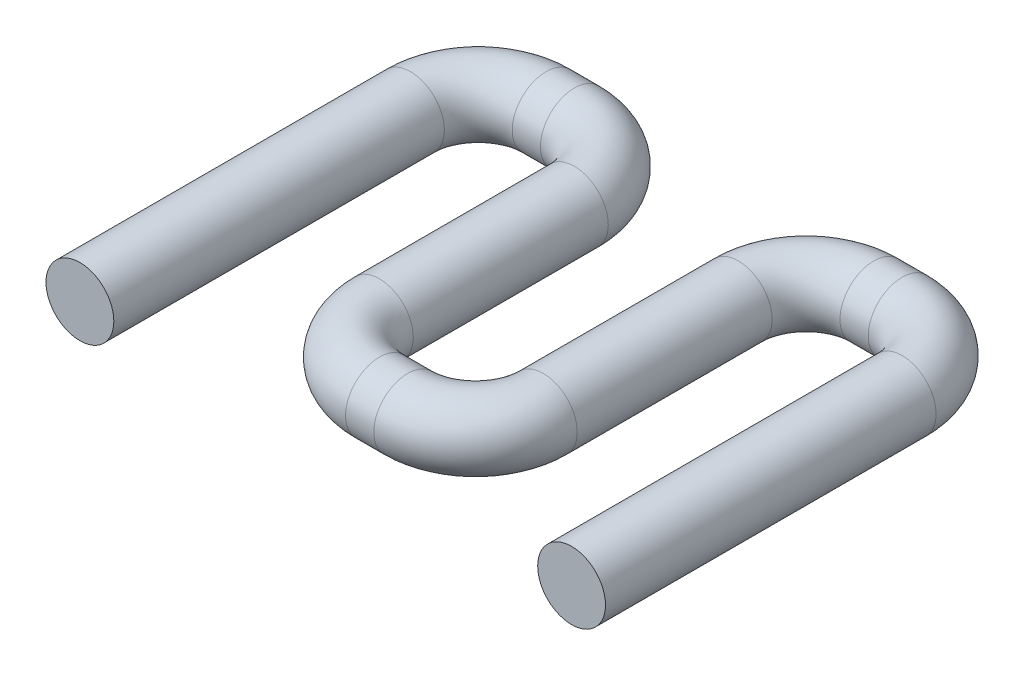
ISO-10303-21;
HEADER;
FILE_DESCRIPTION(('STEP AP214'),'2;1');
FILE_NAME('part.step','',(''),(''),'','','');
FILE_SCHEMA(('AUTOMOTIVE_DESIGN { 1 0 10303 214 1 1 1 1 }'));
ENDSEC;
DATA;
#1=APPLICATION_CONTEXT('core data for automotive mechanical design processes');
#2=APPLICATION_PROTOCOL_DEFINITION('international standard','automotive_design',2000,#1);
#3=PRODUCT_CONTEXT('',#1,'mechanical');
#4=PRODUCT('Part','Part','',(#3));
#5=PRODUCT_RELATED_PRODUCT_CATEGORY('part','',(#4));
#6=PRODUCT_DEFINITION_FORMATION('','',#4);
#7=PRODUCT_DEFINITION_CONTEXT('part definition',#1,'design');
#8=PRODUCT_DEFINITION('design','',#6,#7);
#9=PRODUCT_DEFINITION_SHAPE('','',#8);
#10=(LENGTH_UNIT() NAMED_UNIT(*) SI_UNIT(.MILLI.,.METRE.));
#11=(NAMED_UNIT(*) PLANE_ANGLE_UNIT() SI_UNIT($,.RADIAN.));
#12=(NAMED_UNIT(*) SI_UNIT($,.STERADIAN.) SOLID_ANGLE_UNIT());
#13=UNCERTAINTY_MEASURE_WITH_UNIT(LENGTH_MEASURE(1.E-05),#10,'distance_accuracy_value','');
#14=(GEOMETRIC_REPRESENTATION_CONTEXT(3) GLOBAL_UNCERTAINTY_ASSIGNED_CONTEXT((#13)) GLOBAL_UNIT_ASSIGNED_CONTEXT((#10,
#11,#12)) REPRESENTATION_CONTEXT('',''));
#15=CARTESIAN_POINT('',(0.,0.,0.));
#16=DIRECTION('',(0.,0.,1.));
#17=DIRECTION('',(1.,0.,0.));
#18=AXIS2_PLACEMENT_3D('',#15,#16,#17);
#19=CARTESIAN_POINT('',(0.,0.,0.));
#20=DIRECTION('',(0.,0.,1.));
#21=DIRECTION('',(1.,0.,0.));
#22=AXIS2_PLACEMENT_3D('',#19,#20,#21);
#23=PLANE('',#22);
#24=CARTESIAN_POINT('',(0.,0.,0.));
#25=DIRECTION('',(0.,0.,1.));
#26=DIRECTION('',(1.,0.,0.));
#27=AXIS2_PLACEMENT_3D('',#24,#25,#26);
#28=CIRCLE('',#27,12.7);
#29=CARTESIAN_POINT('',(12.7,0.,0.));
#30=VERTEX_POINT('',#29);
#31=EDGE_CURVE('E112',#30,#30,#28,.T.);
#32=ORIENTED_EDGE('',*,*,#31,.T.);
#33=EDGE_LOOP('',(#32));
#34=FACE_BOUND('',#33,.T.);
#35=ADVANCED_FACE('F53',(#34),#23,.T.);
#36=CARTESIAN_POINT('',(184.1754,0.,0.));
#37=DIRECTION('',(0.,0.,-1.));
#38=DIRECTION('',(-1.,0.,0.));
#39=AXIS2_PLACEMENT_3D('',#36,#37,#38);
#40=PLANE('',#39);
#41=CARTESIAN_POINT('',(184.1754,0.,0.));
#42=DIRECTION('',(0.,0.,-1.));
#43=DIRECTION('',(-1.,0.,0.));
#44=AXIS2_PLACEMENT_3D('',#41,#42,#43);
#45=CIRCLE('',#44,12.7);
#46=CARTESIAN_POINT('',(171.4754,0.,0.));
#47=VERTEX_POINT('',#46);
#48=EDGE_CURVE('E11',#47,#47,#45,.T.);
#49=ORIENTED_EDGE('',*,*,#48,.F.);
#50=EDGE_LOOP('',(#49));
#51=FACE_BOUND('',#50,.T.);
#52=ADVANCED_FACE('F121',(#51),#40,.F.);
#53=CARTESIAN_POINT('',(0.,0.,0.));
#54=DIRECTION('',(0.,0.,-1.));
#55=DIRECTION('',(-1.,0.,0.));
#56=AXIS2_PLACEMENT_3D('',#53,#54,#55);
#57=CYLINDRICAL_SURFACE('',#56,12.7);
#58=CARTESIAN_POINT('',(0.,0.,-123.825));
#59=DIRECTION('',(0.,0.,1.));
#60=DIRECTION('',(1.,0.,0.));
#61=AXIS2_PLACEMENT_3D('',#58,#59,#60);
#62=CIRCLE('',#61,12.7);
#63=CARTESIAN_POINT('',(-12.7,0.,-123.825));
#64=VERTEX_POINT('',#63);
#65=EDGE_CURVE('E108',#64,#64,#62,.T.);
#66=ORIENTED_EDGE('',*,*,#65,.T.);
#67=EDGE_LOOP('',(#66));
#68=FACE_BOUND('',#67,.T.);
#69=ORIENTED_EDGE('',*,*,#31,.F.);
#70=EDGE_LOOP('',(#69));
#71=FACE_BOUND('',#70,.T.);
#72=ADVANCED_FACE('F118',(#68,#71),#57,.T.);
#73=CARTESIAN_POINT('',(25.4,0.,-123.825));
#74=DIRECTION('',(0.,-1.,0.));
#75=DIRECTION('',(0.,0.,-1.));
#76=AXIS2_PLACEMENT_3D('',#73,#74,#75);
#77=TOROIDAL_SURFACE('',#76,25.4,12.7);
#78=CARTESIAN_POINT('',(25.4,0.,-149.225));
#79=DIRECTION('',(-1.,0.,0.));
#80=DIRECTION('',(0.,0.,1.));
#81=AXIS2_PLACEMENT_3D('',#78,#79,#80);
#82=CIRCLE('',#81,12.7);
#83=CARTESIAN_POINT('',(25.4,0.,-161.925));
#84=VERTEX_POINT('',#83);
#85=EDGE_CURVE('E104',#84,#84,#82,.T.);
#86=CARTESIAN_POINT('',(25.4,0.,-123.825));
#87=DIRECTION('',(0.,-1.,0.));
#88=DIRECTION('',(0.,0.,-1.));
#89=AXIS2_PLACEMENT_3D('',#86,#87,#88);
#90=CIRCLE('',#89,38.1);
#91=EDGE_CURVE('',#64,#84,#90,.T.);
#92=ORIENTED_EDGE('',*,*,#65,.F.);
#93=ORIENTED_EDGE('',*,*,#85,.T.);
#94=ORIENTED_EDGE('',*,*,#91,.T.);
#95=ORIENTED_EDGE('',*,*,#91,.F.);
#96=EDGE_LOOP('',(#92,#94,#93,#95));
#97=FACE_BOUND('',#96,.T.);
#98=ADVANCED_FACE('F120',(#97),#77,.T.);
#99=CARTESIAN_POINT('',(25.4,0.,-149.225));
#100=DIRECTION('',(1.,0.,0.));
#101=DIRECTION('',(0.,0.,-1.));
#102=AXIS2_PLACEMENT_3D('',#99,#100,#101);
#103=CYLINDRICAL_SURFACE('',#102,12.7);
#104=CARTESIAN_POINT('',(35.9918,0.,-149.225));
#105=DIRECTION('',(-1.,0.,0.));
#106=DIRECTION('',(0.,0.,1.));
#107=AXIS2_PLACEMENT_3D('',#104,#105,#106);
#108=CIRCLE('',#107,12.7);
#109=CARTESIAN_POINT('',(35.9918,0.,-161.925));
#110=VERTEX_POINT('',#109);
#111=EDGE_CURVE('E100',#110,#110,#108,.T.);
#112=ORIENTED_EDGE('',*,*,#111,.T.);
#113=EDGE_LOOP('',(#112));
#114=FACE_BOUND('',#113,.T.);
#115=ORIENTED_EDGE('',*,*,#85,.F.);
#116=EDGE_LOOP('',(#115));
#117=FACE_BOUND('',#116,.T.);
#118=ADVANCED_FACE('F128',(#114,#117),#103,.T.);
#119=CARTESIAN_POINT('',(35.9918,0.,-123.825));
#120=DIRECTION('',(0.,-1.,0.));
#121=DIRECTION('',(0.,0.,-1.));
#122=AXIS2_PLACEMENT_3D('',#119,#120,#121);
#123=TOROIDAL_SURFACE('',#122,25.4,12.7);
#124=CARTESIAN_POINT('',(61.3918,0.,-123.825));
#125=DIRECTION('',(0.,0.,-1.));
#126=DIRECTION('',(-1.,0.,0.));
#127=AXIS2_PLACEMENT_3D('',#124,#125,#126);
#128=CIRCLE('',#127,12.7);
#129=CARTESIAN_POINT('',(74.0918,0.,-123.825));
#130=VERTEX_POINT('',#129);
#131=EDGE_CURVE('E96',#130,#130,#128,.T.);
#132=CARTESIAN_POINT('',(35.9918,0.,-123.825));
#133=DIRECTION('',(0.,-1.,0.));
#134=DIRECTION('',(0.,0.,-1.));
#135=AXIS2_PLACEMENT_3D('',#132,#133,#134);
#136=CIRCLE('',#135,38.1);
#137=EDGE_CURVE('',#110,#130,#136,.T.);
#138=ORIENTED_EDGE('',*,*,#111,.F.);
#139=ORIENTED_EDGE('',*,*,#131,.T.);
#140=ORIENTED_EDGE('',*,*,#137,.T.);
#141=ORIENTED_EDGE('',*,*,#137,.F.);
#142=EDGE_LOOP('',(#138,#140,#139,#141));
#143=FACE_BOUND('',#142,.T.);
#144=ADVANCED_FACE('F169',(#143),#123,.T.);
#145=CARTESIAN_POINT('',(61.3918,0.,-123.825));
#146=DIRECTION('',(0.,0.,1.));
#147=DIRECTION('',(1.,0.,0.));
#148=AXIS2_PLACEMENT_3D('',#145,#146,#147);
#149=CYLINDRICAL_SURFACE('',#148,12.7);
#150=CARTESIAN_POINT('',(61.3918,0.,-50.8));
#151=DIRECTION('',(0.,0.,-1.));
#152=DIRECTION('',(-1.,0.,0.));
#153=AXIS2_PLACEMENT_3D('',#150,#151,#152);
#154=CIRCLE('',#153,12.7);
#155=CARTESIAN_POINT('',(48.6918,0.,-50.8000000000001));
#156=VERTEX_POINT('',#155);
#157=EDGE_CURVE('E92',#156,#156,#154,.T.);
#158=ORIENTED_EDGE('',*,*,#157,.T.);
#159=EDGE_LOOP('',(#158));
#160=FACE_BOUND('',#159,.T.);
#161=ORIENTED_EDGE('',*,*,#131,.F.);
#162=EDGE_LOOP('',(#161));
#163=FACE_BOUND('',#162,.T.);
#164=ADVANCED_FACE('F165',(#160,#163),#149,.T.);
#165=CARTESIAN_POINT('',(86.7918,0.,-50.8));
#166=DIRECTION('',(0.,1.,0.));
#167=DIRECTION('',(0.,0.,1.));
#168=AXIS2_PLACEMENT_3D('',#165,#166,#167);
#169=TOROIDAL_SURFACE('',#168,25.4,12.7);
#170=CARTESIAN_POINT('',(86.7918,0.,-25.4));
#171=DIRECTION('',(-1.,0.,0.));
#172=DIRECTION('',(0.,0.,1.));
#173=AXIS2_PLACEMENT_3D('',#170,#171,#172);
#174=CIRCLE('',#173,12.7);
#175=CARTESIAN_POINT('',(86.7918,0.,-12.7));
#176=VERTEX_POINT('',#175);
#177=EDGE_CURVE('E88',#176,#176,#174,.T.);
#178=CARTESIAN_POINT('',(86.7918,0.,-50.8));
#179=DIRECTION('',(0.,1.,0.));
#180=DIRECTION('',(0.,0.,1.));
#181=AXIS2_PLACEMENT_3D('',#178,#179,#180);
#182=CIRCLE('',#181,38.1);
#183=EDGE_CURVE('',#156,#176,#182,.T.);
#184=ORIENTED_EDGE('',*,*,#157,.F.);
#185=ORIENTED_EDGE('',*,*,#177,.T.);
#186=ORIENTED_EDGE('',*,*,#183,.T.);
#187=ORIENTED_EDGE('',*,*,#183,.F.);
#188=EDGE_LOOP('',(#184,#186,#185,#187));
#189=FACE_BOUND('',#188,.T.);
#190=ADVANCED_FACE('F161',(#189),#169,.T.);
#191=CARTESIAN_POINT('',(86.7918,0.,-25.4));
#192=DIRECTION('',(1.,0.,0.));
#193=DIRECTION('',(0.,0.,-1.));
#194=AXIS2_PLACEMENT_3D('',#191,#192,#193);
#195=CYLINDRICAL_SURFACE('',#194,12.7);
#196=CARTESIAN_POINT('',(97.3836,0.,-25.4));
#197=DIRECTION('',(-1.,0.,0.));
#198=DIRECTION('',(0.,0.,1.));
#199=AXIS2_PLACEMENT_3D('',#196,#197,#198);
#200=CIRCLE('',#199,12.7);
#201=CARTESIAN_POINT('',(97.3836,0.,-12.7));
#202=VERTEX_POINT('',#201);
#203=EDGE_CURVE('E84',#202,#202,#200,.T.);
#204=ORIENTED_EDGE('',*,*,#203,.T.);
#205=EDGE_LOOP('',(#204));
#206=FACE_BOUND('',#205,.T.);
#207=ORIENTED_EDGE('',*,*,#177,.F.);
#208=EDGE_LOOP('',(#207));
#209=FACE_BOUND('',#208,.T.);
#210=ADVANCED_FACE('F157',(#206,#209),#195,.T.);
#211=CARTESIAN_POINT('',(97.3836,0.,-50.8));
#212=DIRECTION('',(0.,1.,0.));
#213=DIRECTION('',(0.,0.,1.));
#214=AXIS2_PLACEMENT_3D('',#211,#212,#213);
#215=TOROIDAL_SURFACE('',#214,25.4,12.7);
#216=CARTESIAN_POINT('',(122.7836,0.,-50.8));
#217=DIRECTION('',(0.,0.,1.));
#218=DIRECTION('',(1.,0.,0.));
#219=AXIS2_PLACEMENT_3D('',#216,#217,#218);
#220=CIRCLE('',#219,12.7);
#221=CARTESIAN_POINT('',(135.4836,0.,-50.8));
#222=VERTEX_POINT('',#221);
#223=EDGE_CURVE('E80',#222,#222,#220,.T.);
#224=CARTESIAN_POINT('',(97.3836,0.,-50.8));
#225=DIRECTION('',(0.,1.,0.));
#226=DIRECTION('',(0.,0.,1.));
#227=AXIS2_PLACEMENT_3D('',#224,#225,#226);
#228=CIRCLE('',#227,38.1);
#229=EDGE_CURVE('',#202,#222,#228,.T.);
#230=ORIENTED_EDGE('',*,*,#203,.F.);
#231=ORIENTED_EDGE('',*,*,#223,.T.);
#232=ORIENTED_EDGE('',*,*,#229,.T.);
#233=ORIENTED_EDGE('',*,*,#229,.F.);
#234=EDGE_LOOP('',(#230,#232,#231,#233));
#235=FACE_BOUND('',#234,.T.);
#236=ADVANCED_FACE('F153',(#235),#215,.T.);
#237=CARTESIAN_POINT('',(122.7836,0.,-50.8));
#238=DIRECTION('',(0.,0.,-1.));
#239=DIRECTION('',(-1.,0.,0.));
#240=AXIS2_PLACEMENT_3D('',#237,#238,#239);
#241=CYLINDRICAL_SURFACE('',#240,12.7);
#242=CARTESIAN_POINT('',(122.7836,0.,-123.825));
#243=DIRECTION('',(0.,0.,1.));
#244=DIRECTION('',(1.,0.,0.));
#245=AXIS2_PLACEMENT_3D('',#242,#243,#244);
#246=CIRCLE('',#245,12.7);
#247=CARTESIAN_POINT('',(110.0836,0.,-123.825));
#248=VERTEX_POINT('',#247);
#249=EDGE_CURVE('E76',#248,#248,#246,.T.);
#250=ORIENTED_EDGE('',*,*,#249,.T.);
#251=EDGE_LOOP('',(#250));
#252=FACE_BOUND('',#251,.T.);
#253=ORIENTED_EDGE('',*,*,#223,.F.);
#254=EDGE_LOOP('',(#253));
#255=FACE_BOUND('',#254,.T.);
#256=ADVANCED_FACE('F149',(#252,#255),#241,.T.);
#257=CARTESIAN_POINT('',(148.1836,0.,-123.825));
#258=DIRECTION('',(0.,-1.,0.));
#259=DIRECTION('',(0.,0.,-1.));
#260=AXIS2_PLACEMENT_3D('',#257,#258,#259);
#261=TOROIDAL_SURFACE('',#260,25.4,12.7);
#262=CARTESIAN_POINT('',(148.1836,0.,-149.225));
#263=DIRECTION('',(-1.,0.,0.));
#264=DIRECTION('',(0.,0.,1.));
#265=AXIS2_PLACEMENT_3D('',#262,#263,#264);
#266=CIRCLE('',#265,12.7);
#267=CARTESIAN_POINT('',(148.1836,0.,-161.925));
#268=VERTEX_POINT('',#267);
#269=EDGE_CURVE('E70',#268,#268,#266,.T.);
#270=CARTESIAN_POINT('',(148.1836,0.,-123.825));
#271=DIRECTION('',(0.,-1.,0.));
#272=DIRECTION('',(0.,0.,-1.));
#273=AXIS2_PLACEMENT_3D('',#270,#271,#272);
#274=CIRCLE('',#273,38.1);
#275=EDGE_CURVE('',#248,#268,#274,.T.);
#276=ORIENTED_EDGE('',*,*,#249,.F.);
#277=ORIENTED_EDGE('',*,*,#269,.T.);
#278=ORIENTED_EDGE('',*,*,#275,.T.);
#279=ORIENTED_EDGE('',*,*,#275,.F.);
#280=EDGE_LOOP('',(#276,#278,#277,#279));
#281=FACE_BOUND('',#280,.T.);
#282=ADVANCED_FACE('F145',(#281),#261,.T.);
#283=CARTESIAN_POINT('',(148.1836,0.,-149.225));
#284=DIRECTION('',(1.,0.,0.));
#285=DIRECTION('',(0.,0.,-1.));
#286=AXIS2_PLACEMENT_3D('',#283,#284,#285);
#287=CYLINDRICAL_SURFACE('',#286,12.7);
#288=CARTESIAN_POINT('',(158.7754,0.,-149.225));
#289=DIRECTION('',(-1.,0.,0.));
#290=DIRECTION('',(0.,0.,1.));
#291=AXIS2_PLACEMENT_3D('',#288,#289,#290);
#292=CIRCLE('',#291,12.7);
#293=CARTESIAN_POINT('',(158.7754,0.,-161.925));
#294=VERTEX_POINT('',#293);
#295=EDGE_CURVE('E65',#294,#294,#292,.T.);
#296=ORIENTED_EDGE('',*,*,#295,.T.);
#297=EDGE_LOOP('',(#296));
#298=FACE_BOUND('',#297,.T.);
#299=ORIENTED_EDGE('',*,*,#269,.F.);
#300=EDGE_LOOP('',(#299));
#301=FACE_BOUND('',#300,.T.);
#302=ADVANCED_FACE('F139',(#298,#301),#287,.T.);
#303=CARTESIAN_POINT('',(158.7754,0.,-123.825));
#304=DIRECTION('',(0.,-1.,0.));
#305=DIRECTION('',(0.,0.,-1.));
#306=AXIS2_PLACEMENT_3D('',#303,#304,#305);
#307=TOROIDAL_SURFACE('',#306,25.4,12.7);
#308=CARTESIAN_POINT('',(184.1754,0.,-123.825));
#309=DIRECTION('',(0.,0.,-1.));
#310=DIRECTION('',(-1.,0.,0.));
#311=AXIS2_PLACEMENT_3D('',#308,#309,#310);
#312=CIRCLE('',#311,12.7);
#313=CARTESIAN_POINT('',(196.8754,0.,-123.825));
#314=VERTEX_POINT('',#313);
#315=EDGE_CURVE('E60',#314,#314,#312,.T.);
#316=CARTESIAN_POINT('',(158.7754,0.,-123.825));
#317=DIRECTION('',(0.,-1.,0.));
#318=DIRECTION('',(0.,0.,-1.));
#319=AXIS2_PLACEMENT_3D('',#316,#317,#318);
#320=CIRCLE('',#319,38.1);
#321=EDGE_CURVE('',#294,#314,#320,.T.);
#322=ORIENTED_EDGE('',*,*,#295,.F.);
#323=ORIENTED_EDGE('',*,*,#315,.T.);
#324=ORIENTED_EDGE('',*,*,#321,.T.);
#325=ORIENTED_EDGE('',*,*,#321,.F.);
#326=EDGE_LOOP('',(#322,#324,#323,#325));
#327=FACE_BOUND('',#326,.T.);
#328=ADVANCED_FACE('F134',(#327),#307,.T.);
#329=CARTESIAN_POINT('',(184.1754,0.,-123.825));
#330=DIRECTION('',(0.,0.,1.));
#331=DIRECTION('',(1.,0.,0.));
#332=AXIS2_PLACEMENT_3D('',#329,#330,#331);
#333=CYLINDRICAL_SURFACE('',#332,12.7);
#334=ORIENTED_EDGE('',*,*,#48,.T.);
#335=EDGE_LOOP('',(#334));
#336=FACE_BOUND('',#335,.T.);
#337=ORIENTED_EDGE('',*,*,#315,.F.);
#338=EDGE_LOOP('',(#337));
#339=FACE_BOUND('',#338,.T.);
#340=ADVANCED_FACE('F132',(#336,#339),#333,.T.);
#341=CLOSED_SHELL('',(#35,#52,#72,#98,#118,#144,#164,#190,#210,#236,#256,#282,#302,#328,#340));
#342=MANIFOLD_SOLID_BREP('B2',#341);
#343=ADVANCED_BREP_SHAPE_REPRESENTATION('',(#18,#342),#14);
#344=SHAPE_DEFINITION_REPRESENTATION(#9,#343);
ENDSEC;
END-ISO-10303-21;
